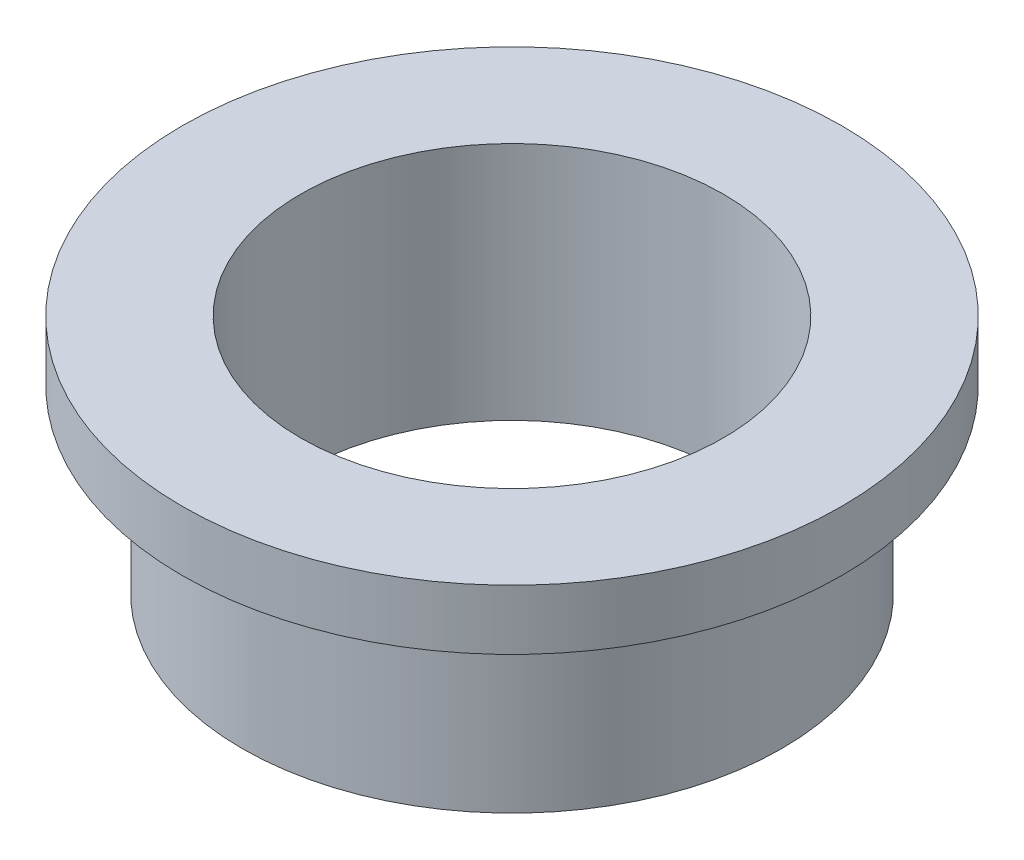
ISO-10303-21;
HEADER;
FILE_DESCRIPTION(('STEP AP214'),'2;1');
FILE_NAME('part.step','',(''),(''),'','','');
FILE_SCHEMA(('AUTOMOTIVE_DESIGN { 1 0 10303 214 1 1 1 1 }'));
ENDSEC;
DATA;
#1=APPLICATION_CONTEXT('core data for automotive mechanical design processes');
#2=APPLICATION_PROTOCOL_DEFINITION('international standard','automotive_design',2000,#1);
#3=PRODUCT_CONTEXT('',#1,'mechanical');
#4=PRODUCT('Part','Part','',(#3));
#5=PRODUCT_RELATED_PRODUCT_CATEGORY('part','',(#4));
#6=PRODUCT_DEFINITION_FORMATION('','',#4);
#7=PRODUCT_DEFINITION_CONTEXT('part definition',#1,'design');
#8=PRODUCT_DEFINITION('design','',#6,#7);
#9=PRODUCT_DEFINITION_SHAPE('','',#8);
#10=(LENGTH_UNIT() NAMED_UNIT(*) SI_UNIT(.MILLI.,.METRE.));
#11=(NAMED_UNIT(*) PLANE_ANGLE_UNIT() SI_UNIT($,.RADIAN.));
#12=(NAMED_UNIT(*) SI_UNIT($,.STERADIAN.) SOLID_ANGLE_UNIT());
#13=UNCERTAINTY_MEASURE_WITH_UNIT(LENGTH_MEASURE(1.E-05),#10,'distance_accuracy_value','');
#14=(GEOMETRIC_REPRESENTATION_CONTEXT(3) GLOBAL_UNCERTAINTY_ASSIGNED_CONTEXT((#13)) GLOBAL_UNIT_ASSIGNED_CONTEXT((#10,
#11,#12)) REPRESENTATION_CONTEXT('',''));
#15=CARTESIAN_POINT('',(0.,0.,0.));
#16=DIRECTION('',(0.,0.,1.));
#17=DIRECTION('',(1.,0.,0.));
#18=AXIS2_PLACEMENT_3D('',#15,#16,#17);
#19=CARTESIAN_POINT('',(0.,0.2,0.));
#20=DIRECTION('',(0.,-1.,0.));
#21=DIRECTION('',(0.,0.,-1.));
#22=AXIS2_PLACEMENT_3D('',#19,#20,#21);
#23=CYLINDRICAL_SURFACE('',#22,4.5);
#24=CARTESIAN_POINT('',(0.,-4.,0.));
#25=DIRECTION('',(0.,-1.,0.));
#26=DIRECTION('',(0.,0.,-1.));
#27=AXIS2_PLACEMENT_3D('',#24,#25,#26);
#28=CIRCLE('',#27,4.5);
#29=CARTESIAN_POINT('',(0.,-4.,-4.5));
#30=VERTEX_POINT('',#29);
#31=EDGE_CURVE('E18',#30,#30,#28,.T.);
#32=ORIENTED_EDGE('',*,*,#31,.F.);
#33=EDGE_LOOP('',(#32));
#34=FACE_BOUND('',#33,.T.);
#35=CARTESIAN_POINT('',(0.,-1.,0.));
#36=DIRECTION('',(0.,-1.,0.));
#37=DIRECTION('',(0.,0.,-1.));
#38=AXIS2_PLACEMENT_3D('',#35,#36,#37);
#39=CIRCLE('',#38,4.5);
#40=CARTESIAN_POINT('',(0.,-1.,-4.5));
#41=VERTEX_POINT('',#40);
#42=EDGE_CURVE('E34',#41,#41,#39,.F.);
#43=ORIENTED_EDGE('',*,*,#42,.F.);
#44=EDGE_LOOP('',(#43));
#45=FACE_BOUND('',#44,.T.);
#46=ADVANCED_FACE('F15',(#34,#45),#23,.T.);
#47=CARTESIAN_POINT('',(0.,-4.,0.));
#48=DIRECTION('',(0.,-1.,0.));
#49=DIRECTION('',(0.,0.,-1.));
#50=AXIS2_PLACEMENT_3D('',#47,#48,#49);
#51=PLANE('',#50);
#52=ORIENTED_EDGE('',*,*,#31,.T.);
#53=EDGE_LOOP('',(#52));
#54=FACE_BOUND('',#53,.T.);
#55=CARTESIAN_POINT('',(0.,-4.,0.));
#56=DIRECTION('',(0.,-1.,0.));
#57=DIRECTION('',(0.,0.,-1.));
#58=AXIS2_PLACEMENT_3D('',#55,#56,#57);
#59=CIRCLE('',#58,3.525);
#60=CARTESIAN_POINT('',(0.,-4.,-3.525));
#61=VERTEX_POINT('',#60);
#62=EDGE_CURVE('E32',#61,#61,#59,.F.);
#63=ORIENTED_EDGE('',*,*,#62,.T.);
#64=EDGE_LOOP('',(#63));
#65=FACE_BOUND('',#64,.T.);
#66=ADVANCED_FACE('F41',(#54,#65),#51,.T.);
#67=CARTESIAN_POINT('',(0.,-1.,0.));
#68=DIRECTION('',(0.,-1.,0.));
#69=DIRECTION('',(0.,0.,-1.));
#70=AXIS2_PLACEMENT_3D('',#67,#68,#69);
#71=PLANE('',#70);
#72=CARTESIAN_POINT('',(0.,-1.,0.));
#73=DIRECTION('',(0.,-1.,0.));
#74=DIRECTION('',(0.,0.,-1.));
#75=AXIS2_PLACEMENT_3D('',#72,#73,#74);
#76=CIRCLE('',#75,5.5);
#77=CARTESIAN_POINT('',(0.,-1.,-5.5));
#78=VERTEX_POINT('',#77);
#79=EDGE_CURVE('E27',#78,#78,#76,.F.);
#80=ORIENTED_EDGE('',*,*,#79,.F.);
#81=EDGE_LOOP('',(#80));
#82=FACE_BOUND('',#81,.T.);
#83=ORIENTED_EDGE('',*,*,#42,.T.);
#84=EDGE_LOOP('',(#83));
#85=FACE_BOUND('',#84,.T.);
#86=ADVANCED_FACE('F50',(#82,#85),#71,.T.);
#87=CARTESIAN_POINT('',(0.,0.2,0.));
#88=DIRECTION('',(0.,-1.,0.));
#89=DIRECTION('',(0.,0.,-1.));
#90=AXIS2_PLACEMENT_3D('',#87,#88,#89);
#91=CYLINDRICAL_SURFACE('',#90,3.525);
#92=ORIENTED_EDGE('',*,*,#62,.F.);
#93=EDGE_LOOP('',(#92));
#94=FACE_BOUND('',#93,.T.);
#95=CARTESIAN_POINT('',(0.,0.,0.));
#96=DIRECTION('',(0.,-1.,0.));
#97=DIRECTION('',(0.,0.,-1.));
#98=AXIS2_PLACEMENT_3D('',#95,#96,#97);
#99=CIRCLE('',#98,3.525);
#100=CARTESIAN_POINT('',(0.,0.,-3.525));
#101=VERTEX_POINT('',#100);
#102=EDGE_CURVE('E22',#101,#101,#99,.F.);
#103=ORIENTED_EDGE('',*,*,#102,.T.);
#104=EDGE_LOOP('',(#103));
#105=FACE_BOUND('',#104,.T.);
#106=ADVANCED_FACE('F59',(#94,#105),#91,.F.);
#107=CARTESIAN_POINT('',(0.,0.2,0.));
#108=DIRECTION('',(0.,-1.,0.));
#109=DIRECTION('',(0.,0.,-1.));
#110=AXIS2_PLACEMENT_3D('',#107,#108,#109);
#111=CYLINDRICAL_SURFACE('',#110,5.5);
#112=ORIENTED_EDGE('',*,*,#79,.T.);
#113=EDGE_LOOP('',(#112));
#114=FACE_BOUND('',#113,.T.);
#115=CARTESIAN_POINT('',(0.,0.,0.));
#116=DIRECTION('',(0.,-1.,0.));
#117=DIRECTION('',(0.,0.,-1.));
#118=AXIS2_PLACEMENT_3D('',#115,#116,#117);
#119=CIRCLE('',#118,5.5);
#120=CARTESIAN_POINT('',(0.,0.,-5.5));
#121=VERTEX_POINT('',#120);
#122=EDGE_CURVE('E10',#121,#121,#119,.T.);
#123=ORIENTED_EDGE('',*,*,#122,.T.);
#124=EDGE_LOOP('',(#123));
#125=FACE_BOUND('',#124,.T.);
#126=ADVANCED_FACE('F53',(#114,#125),#111,.T.);
#127=CARTESIAN_POINT('',(0.,0.,0.));
#128=DIRECTION('',(0.,-1.,0.));
#129=DIRECTION('',(0.,0.,-1.));
#130=AXIS2_PLACEMENT_3D('',#127,#128,#129);
#131=PLANE('',#130);
#132=ORIENTED_EDGE('',*,*,#122,.F.);
#133=EDGE_LOOP('',(#132));
#134=FACE_BOUND('',#133,.T.);
#135=ORIENTED_EDGE('',*,*,#102,.F.);
#136=EDGE_LOOP('',(#135));
#137=FACE_BOUND('',#136,.T.);
#138=ADVANCED_FACE('F51',(#134,#137),#131,.F.);
#139=CLOSED_SHELL('',(#46,#66,#86,#106,#126,#138));
#140=MANIFOLD_SOLID_BREP('B1',#139);
#141=ADVANCED_BREP_SHAPE_REPRESENTATION('',(#18,#140),#14);
#142=SHAPE_DEFINITION_REPRESENTATION(#9,#141);
ENDSEC;
END-ISO-10303-21;
